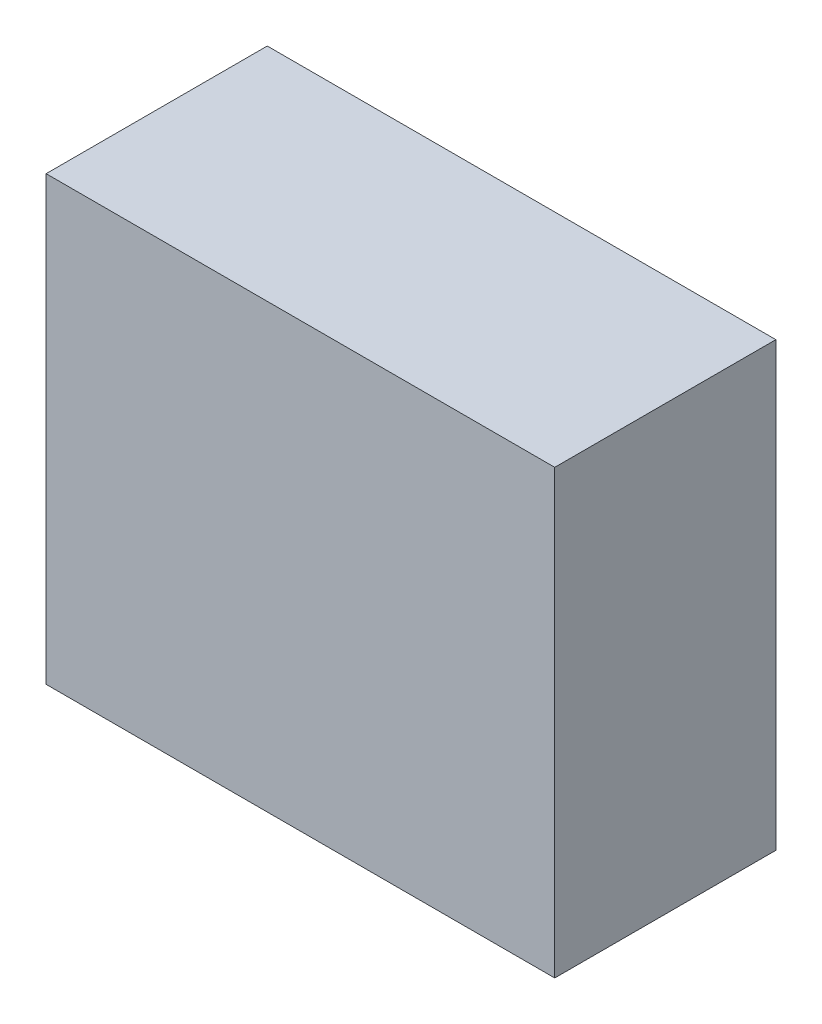
ISO-10303-21;
HEADER;
FILE_DESCRIPTION(('STEP AP214'),'2;1');
FILE_NAME('part.step','',(''),(''),'','','');
FILE_SCHEMA(('AUTOMOTIVE_DESIGN { 1 0 10303 214 1 1 1 1 }'));
ENDSEC;
DATA;
#1=APPLICATION_CONTEXT('core data for automotive mechanical design processes');
#2=APPLICATION_PROTOCOL_DEFINITION('international standard','automotive_design',2000,#1);
#3=PRODUCT_CONTEXT('',#1,'mechanical');
#4=PRODUCT('Part','Part','',(#3));
#5=PRODUCT_RELATED_PRODUCT_CATEGORY('part','',(#4));
#6=PRODUCT_DEFINITION_FORMATION('','',#4);
#7=PRODUCT_DEFINITION_CONTEXT('part definition',#1,'design');
#8=PRODUCT_DEFINITION('design','',#6,#7);
#9=PRODUCT_DEFINITION_SHAPE('','',#8);
#10=(LENGTH_UNIT() NAMED_UNIT(*) SI_UNIT(.MILLI.,.METRE.));
#11=(NAMED_UNIT(*) PLANE_ANGLE_UNIT() SI_UNIT($,.RADIAN.));
#12=(NAMED_UNIT(*) SI_UNIT($,.STERADIAN.) SOLID_ANGLE_UNIT());
#13=UNCERTAINTY_MEASURE_WITH_UNIT(LENGTH_MEASURE(1.E-05),#10,'distance_accuracy_value','');
#14=(GEOMETRIC_REPRESENTATION_CONTEXT(3) GLOBAL_UNCERTAINTY_ASSIGNED_CONTEXT((#13)) GLOBAL_UNIT_ASSIGNED_CONTEXT((#10,
#11,#12)) REPRESENTATION_CONTEXT('',''));
#15=CARTESIAN_POINT('',(0.,0.,0.));
#16=DIRECTION('',(0.,0.,1.));
#17=DIRECTION('',(1.,0.,0.));
#18=AXIS2_PLACEMENT_3D('',#15,#16,#17);
#19=CARTESIAN_POINT('',(0.,0.,10.));
#20=DIRECTION('',(1.,0.,0.));
#21=DIRECTION('',(0.,0.,-1.));
#22=AXIS2_PLACEMENT_3D('',#19,#20,#21);
#23=PLANE('',#22);
#24=DIRECTION('',(0.,-1.,0.));
#25=VECTOR('',#24,1.);
#26=CARTESIAN_POINT('',(0.,0.,0.));
#27=LINE('',#26,#25);
#28=CARTESIAN_POINT('',(0.,20.,0.));
#29=VERTEX_POINT('',#28);
#30=CARTESIAN_POINT('',(0.,0.,0.));
#31=VERTEX_POINT('',#30);
#32=EDGE_CURVE('E106',#29,#31,#27,.T.);
#33=ORIENTED_EDGE('',*,*,#32,.T.);
#34=DIRECTION('',(0.,0.,-1.));
#35=VECTOR('',#34,1.);
#36=CARTESIAN_POINT('',(0.,0.,10.));
#37=LINE('',#36,#35);
#38=CARTESIAN_POINT('',(0.,0.,10.));
#39=VERTEX_POINT('',#38);
#40=EDGE_CURVE('E11',#39,#31,#37,.T.);
#41=ORIENTED_EDGE('',*,*,#40,.F.);
#42=DIRECTION('',(0.,-1.,0.));
#43=VECTOR('',#42,1.);
#44=CARTESIAN_POINT('',(0.,0.,10.));
#45=LINE('',#44,#43);
#46=CARTESIAN_POINT('',(0.,20.,10.));
#47=VERTEX_POINT('',#46);
#48=EDGE_CURVE('E92',#47,#39,#45,.T.);
#49=ORIENTED_EDGE('',*,*,#48,.F.);
#50=DIRECTION('',(0.,0.,-1.));
#51=VECTOR('',#50,1.);
#52=CARTESIAN_POINT('',(0.,20.,10.));
#53=LINE('',#52,#51);
#54=EDGE_CURVE('E105',#47,#29,#53,.T.);
#55=ORIENTED_EDGE('',*,*,#54,.T.);
#56=EDGE_LOOP('',(#33,#41,#49,#55));
#57=FACE_BOUND('',#56,.T.);
#58=ADVANCED_FACE('F43',(#57),#23,.F.);
#59=CARTESIAN_POINT('',(0.,0.,10.));
#60=DIRECTION('',(0.,1.,0.));
#61=DIRECTION('',(0.,0.,1.));
#62=AXIS2_PLACEMENT_3D('',#59,#60,#61);
#63=PLANE('',#62);
#64=DIRECTION('',(1.,0.,0.));
#65=VECTOR('',#64,1.);
#66=CARTESIAN_POINT('',(0.,0.,0.));
#67=LINE('',#66,#65);
#68=CARTESIAN_POINT('',(23.,0.,0.));
#69=VERTEX_POINT('',#68);
#70=EDGE_CURVE('E97',#31,#69,#67,.T.);
#71=ORIENTED_EDGE('',*,*,#70,.T.);
#72=DIRECTION('',(0.,0.,-1.));
#73=VECTOR('',#72,1.);
#74=CARTESIAN_POINT('',(23.,0.,10.));
#75=LINE('',#74,#73);
#76=CARTESIAN_POINT('',(23.,0.,10.));
#77=VERTEX_POINT('',#76);
#78=EDGE_CURVE('E51',#77,#69,#75,.T.);
#79=ORIENTED_EDGE('',*,*,#78,.F.);
#80=DIRECTION('',(1.,0.,0.));
#81=VECTOR('',#80,1.);
#82=CARTESIAN_POINT('',(0.,0.,10.));
#83=LINE('',#82,#81);
#84=EDGE_CURVE('E87',#39,#77,#83,.T.);
#85=ORIENTED_EDGE('',*,*,#84,.F.);
#86=ORIENTED_EDGE('',*,*,#40,.T.);
#87=EDGE_LOOP('',(#71,#79,#85,#86));
#88=FACE_BOUND('',#87,.T.);
#89=ADVANCED_FACE('F100',(#88),#63,.F.);
#90=CARTESIAN_POINT('',(23.,0.,10.));
#91=DIRECTION('',(-1.,0.,0.));
#92=DIRECTION('',(0.,0.,1.));
#93=AXIS2_PLACEMENT_3D('',#90,#91,#92);
#94=PLANE('',#93);
#95=DIRECTION('',(0.,1.,0.));
#96=VECTOR('',#95,1.);
#97=CARTESIAN_POINT('',(23.,0.,0.));
#98=LINE('',#97,#96);
#99=CARTESIAN_POINT('',(23.,20.,0.));
#100=VERTEX_POINT('',#99);
#101=EDGE_CURVE('E78',#69,#100,#98,.T.);
#102=ORIENTED_EDGE('',*,*,#101,.T.);
#103=DIRECTION('',(0.,0.,-1.));
#104=VECTOR('',#103,1.);
#105=CARTESIAN_POINT('',(23.,20.,10.));
#106=LINE('',#105,#104);
#107=CARTESIAN_POINT('',(23.,20.,10.));
#108=VERTEX_POINT('',#107);
#109=EDGE_CURVE('E98',#108,#100,#106,.T.);
#110=ORIENTED_EDGE('',*,*,#109,.F.);
#111=DIRECTION('',(0.,1.,0.));
#112=VECTOR('',#111,1.);
#113=CARTESIAN_POINT('',(23.,0.,10.));
#114=LINE('',#113,#112);
#115=EDGE_CURVE('E95',#77,#108,#114,.T.);
#116=ORIENTED_EDGE('',*,*,#115,.F.);
#117=ORIENTED_EDGE('',*,*,#78,.T.);
#118=EDGE_LOOP('',(#102,#110,#116,#117));
#119=FACE_BOUND('',#118,.T.);
#120=ADVANCED_FACE('F99',(#119),#94,.F.);
#121=CARTESIAN_POINT('',(0.,20.,10.));
#122=DIRECTION('',(0.,-1.,0.));
#123=DIRECTION('',(0.,0.,-1.));
#124=AXIS2_PLACEMENT_3D('',#121,#122,#123);
#125=PLANE('',#124);
#126=DIRECTION('',(-1.,0.,0.));
#127=VECTOR('',#126,1.);
#128=CARTESIAN_POINT('',(0.,20.,0.));
#129=LINE('',#128,#127);
#130=EDGE_CURVE('E85',#100,#29,#129,.T.);
#131=ORIENTED_EDGE('',*,*,#130,.T.);
#132=ORIENTED_EDGE('',*,*,#54,.F.);
#133=DIRECTION('',(-1.,0.,0.));
#134=VECTOR('',#133,1.);
#135=CARTESIAN_POINT('',(0.,20.,10.));
#136=LINE('',#135,#134);
#137=EDGE_CURVE('E56',#108,#47,#136,.T.);
#138=ORIENTED_EDGE('',*,*,#137,.F.);
#139=ORIENTED_EDGE('',*,*,#109,.T.);
#140=EDGE_LOOP('',(#131,#132,#138,#139));
#141=FACE_BOUND('',#140,.T.);
#142=ADVANCED_FACE('F111',(#141),#125,.F.);
#143=CARTESIAN_POINT('',(0.,0.,10.));
#144=DIRECTION('',(0.,0.,-1.));
#145=DIRECTION('',(-1.,0.,0.));
#146=AXIS2_PLACEMENT_3D('',#143,#144,#145);
#147=PLANE('',#146);
#148=ORIENTED_EDGE('',*,*,#48,.T.);
#149=ORIENTED_EDGE('',*,*,#84,.T.);
#150=ORIENTED_EDGE('',*,*,#115,.T.);
#151=ORIENTED_EDGE('',*,*,#137,.T.);
#152=EDGE_LOOP('',(#148,#149,#150,#151));
#153=FACE_BOUND('',#152,.T.);
#154=ADVANCED_FACE('F89',(#153),#147,.F.);
#155=CARTESIAN_POINT('',(0.,0.,0.));
#156=DIRECTION('',(0.,0.,-1.));
#157=DIRECTION('',(-1.,0.,0.));
#158=AXIS2_PLACEMENT_3D('',#155,#156,#157);
#159=PLANE('',#158);
#160=ORIENTED_EDGE('',*,*,#32,.F.);
#161=ORIENTED_EDGE('',*,*,#130,.F.);
#162=ORIENTED_EDGE('',*,*,#101,.F.);
#163=ORIENTED_EDGE('',*,*,#70,.F.);
#164=EDGE_LOOP('',(#160,#161,#162,#163));
#165=FACE_BOUND('',#164,.T.);
#166=ADVANCED_FACE('F116',(#165),#159,.T.);
#167=CLOSED_SHELL('',(#58,#89,#120,#142,#154,#166));
#168=MANIFOLD_SOLID_BREP('B2',#167);
#169=ADVANCED_BREP_SHAPE_REPRESENTATION('',(#18,#168),#14);
#170=SHAPE_DEFINITION_REPRESENTATION(#9,#169);
ENDSEC;
END-ISO-10303-21;
